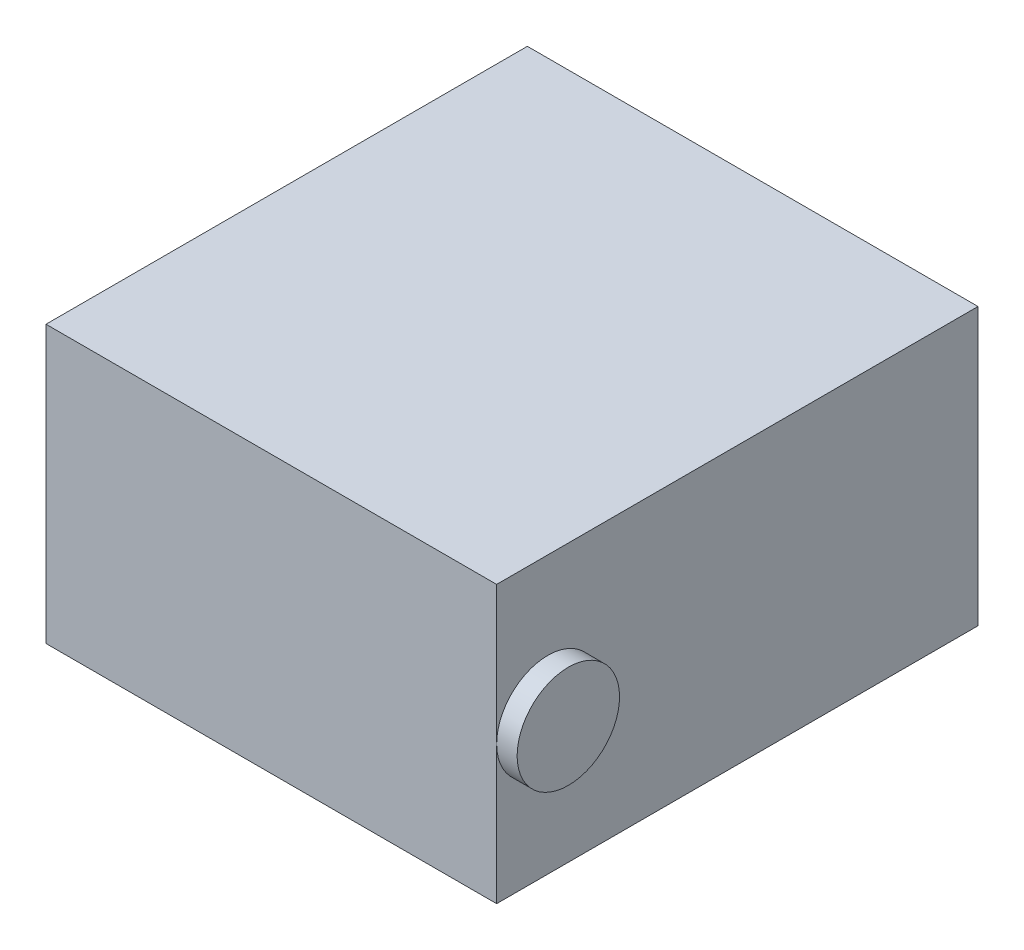
ISO-10303-21;
HEADER;
FILE_DESCRIPTION(('STEP AP214'),'2;1');
FILE_NAME('part.step','',(''),(''),'','','');
FILE_SCHEMA(('AUTOMOTIVE_DESIGN { 1 0 10303 214 1 1 1 1 }'));
ENDSEC;
DATA;
#1=APPLICATION_CONTEXT('core data for automotive mechanical design processes');
#2=APPLICATION_PROTOCOL_DEFINITION('international standard','automotive_design',2000,#1);
#3=PRODUCT_CONTEXT('',#1,'mechanical');
#4=PRODUCT('Part','Part','',(#3));
#5=PRODUCT_RELATED_PRODUCT_CATEGORY('part','',(#4));
#6=PRODUCT_DEFINITION_FORMATION('','',#4);
#7=PRODUCT_DEFINITION_CONTEXT('part definition',#1,'design');
#8=PRODUCT_DEFINITION('design','',#6,#7);
#9=PRODUCT_DEFINITION_SHAPE('','',#8);
#10=(LENGTH_UNIT() NAMED_UNIT(*) SI_UNIT(.MILLI.,.METRE.));
#11=(NAMED_UNIT(*) PLANE_ANGLE_UNIT() SI_UNIT($,.RADIAN.));
#12=(NAMED_UNIT(*) SI_UNIT($,.STERADIAN.) SOLID_ANGLE_UNIT());
#13=UNCERTAINTY_MEASURE_WITH_UNIT(LENGTH_MEASURE(1.E-05),#10,'distance_accuracy_value','');
#14=(GEOMETRIC_REPRESENTATION_CONTEXT(3) GLOBAL_UNCERTAINTY_ASSIGNED_CONTEXT((#13)) GLOBAL_UNIT_ASSIGNED_CONTEXT((#10,
#11,#12)) REPRESENTATION_CONTEXT('',''));
#15=CARTESIAN_POINT('',(0.,0.,0.));
#16=DIRECTION('',(0.,0.,1.));
#17=DIRECTION('',(1.,0.,0.));
#18=AXIS2_PLACEMENT_3D('',#15,#16,#17);
#19=CARTESIAN_POINT('',(0.,85.725,0.));
#20=DIRECTION('',(1.,0.,0.));
#21=DIRECTION('',(0.,0.,-1.));
#22=AXIS2_PLACEMENT_3D('',#19,#20,#21);
#23=PLANE('',#22);
#24=CARTESIAN_POINT('',(0.,79.375,-6.35));
#25=DIRECTION('',(-1.,0.,0.));
#26=DIRECTION('',(0.,0.,1.));
#27=AXIS2_PLACEMENT_3D('',#24,#25,#26);
#28=CIRCLE('',#27,1.5875);
#29=CARTESIAN_POINT('',(0.,79.375,-4.7625));
#30=VERTEX_POINT('',#29);
#31=EDGE_CURVE('E194',#30,#30,#28,.T.);
#32=ORIENTED_EDGE('',*,*,#31,.F.);
#33=EDGE_LOOP('',(#32));
#34=FACE_BOUND('',#33,.T.);
#35=CARTESIAN_POINT('',(0.,79.375,-142.875));
#36=DIRECTION('',(-1.,0.,0.));
#37=DIRECTION('',(0.,0.,1.));
#38=AXIS2_PLACEMENT_3D('',#35,#36,#37);
#39=CIRCLE('',#38,1.58749999999999);
#40=CARTESIAN_POINT('',(0.,79.375,-141.2875));
#41=VERTEX_POINT('',#40);
#42=EDGE_CURVE('E189',#41,#41,#39,.T.);
#43=ORIENTED_EDGE('',*,*,#42,.F.);
#44=EDGE_LOOP('',(#43));
#45=FACE_BOUND('',#44,.T.);
#46=CARTESIAN_POINT('',(0.,15.875,-142.875));
#47=DIRECTION('',(-1.,0.,0.));
#48=DIRECTION('',(0.,0.,1.));
#49=AXIS2_PLACEMENT_3D('',#46,#47,#48);
#50=CIRCLE('',#49,1.58749999999999);
#51=CARTESIAN_POINT('',(0.,15.875,-141.2875));
#52=VERTEX_POINT('',#51);
#53=EDGE_CURVE('E185',#52,#52,#50,.T.);
#54=ORIENTED_EDGE('',*,*,#53,.F.);
#55=EDGE_LOOP('',(#54));
#56=FACE_BOUND('',#55,.T.);
#57=CARTESIAN_POINT('',(0.,6.35,-30.1625));
#58=DIRECTION('',(-1.,0.,0.));
#59=DIRECTION('',(0.,0.,1.));
#60=AXIS2_PLACEMENT_3D('',#57,#58,#59);
#61=CIRCLE('',#60,1.5875);
#62=CARTESIAN_POINT('',(0.,6.35,-28.575));
#63=VERTEX_POINT('',#62);
#64=EDGE_CURVE('E179',#63,#63,#61,.T.);
#65=ORIENTED_EDGE('',*,*,#64,.F.);
#66=EDGE_LOOP('',(#65));
#67=FACE_BOUND('',#66,.T.);
#68=DIRECTION('',(0.,0.,1.));
#69=VECTOR('',#68,1.);
#70=CARTESIAN_POINT('',(0.,0.,0.));
#71=LINE('',#70,#69);
#72=CARTESIAN_POINT('',(0.,0.,-149.225));
#73=VERTEX_POINT('',#72);
#74=CARTESIAN_POINT('',(0.,0.,0.));
#75=VERTEX_POINT('',#74);
#76=EDGE_CURVE('E131',#73,#75,#71,.T.);
#77=ORIENTED_EDGE('',*,*,#76,.T.);
#78=DIRECTION('',(0.,-1.,0.));
#79=VECTOR('',#78,1.);
#80=CARTESIAN_POINT('',(0.,85.725,0.));
#81=LINE('',#80,#79);
#82=CARTESIAN_POINT('',(0.,85.725,0.));
#83=VERTEX_POINT('',#82);
#84=EDGE_CURVE('E11',#83,#75,#81,.T.);
#85=ORIENTED_EDGE('',*,*,#84,.F.);
#86=DIRECTION('',(0.,0.,1.));
#87=VECTOR('',#86,1.);
#88=CARTESIAN_POINT('',(0.,85.725,0.));
#89=LINE('',#88,#87);
#90=CARTESIAN_POINT('',(0.,85.725,-149.225));
#91=VERTEX_POINT('',#90);
#92=EDGE_CURVE('E130',#91,#83,#89,.T.);
#93=ORIENTED_EDGE('',*,*,#92,.F.);
#94=DIRECTION('',(0.,-1.,0.));
#95=VECTOR('',#94,1.);
#96=CARTESIAN_POINT('',(0.,85.725,-149.225));
#97=LINE('',#96,#95);
#98=EDGE_CURVE('E118',#91,#73,#97,.T.);
#99=ORIENTED_EDGE('',*,*,#98,.T.);
#100=EDGE_LOOP('',(#77,#85,#93,#99));
#101=FACE_BOUND('',#100,.T.);
#102=DIRECTION('',(0.,-1.,0.));
#103=VECTOR('',#102,1.);
#104=CARTESIAN_POINT('',(0.,53.975,-53.975));
#105=LINE('',#104,#103);
#106=CARTESIAN_POINT('',(0.,53.975,-53.975));
#107=VERTEX_POINT('',#106);
#108=CARTESIAN_POINT('',(0.,31.75,-53.975));
#109=VERTEX_POINT('',#108);
#110=EDGE_CURVE('E52',#107,#109,#105,.T.);
#111=ORIENTED_EDGE('',*,*,#110,.F.);
#112=DIRECTION('',(0.,0.,-1.));
#113=VECTOR('',#112,1.);
#114=CARTESIAN_POINT('',(0.,53.975,-53.975));
#115=LINE('',#114,#113);
#116=CARTESIAN_POINT('',(0.,53.975,-6.35));
#117=VERTEX_POINT('',#116);
#118=EDGE_CURVE('E60',#117,#107,#115,.T.);
#119=ORIENTED_EDGE('',*,*,#118,.F.);
#120=DIRECTION('',(0.,1.,0.));
#121=VECTOR('',#120,1.);
#122=CARTESIAN_POINT('',(0.,53.975,-6.35));
#123=LINE('',#122,#121);
#124=CARTESIAN_POINT('',(0.,31.75,-6.35));
#125=VERTEX_POINT('',#124);
#126=EDGE_CURVE('E154',#125,#117,#123,.T.);
#127=ORIENTED_EDGE('',*,*,#126,.F.);
#128=DIRECTION('',(0.,0.,1.));
#129=VECTOR('',#128,1.);
#130=CARTESIAN_POINT('',(0.,31.75,-53.975));
#131=LINE('',#130,#129);
#132=EDGE_CURVE('E160',#109,#125,#131,.T.);
#133=ORIENTED_EDGE('',*,*,#132,.F.);
#134=EDGE_LOOP('',(#111,#119,#127,#133));
#135=FACE_BOUND('',#134,.T.);
#136=ADVANCED_FACE('F39',(#34,#45,#56,#67,#101,#135),#23,.F.);
#137=CARTESIAN_POINT('',(0.,85.725,0.));
#138=DIRECTION('',(0.,0.,-1.));
#139=DIRECTION('',(-1.,0.,0.));
#140=AXIS2_PLACEMENT_3D('',#137,#138,#139);
#141=PLANE('',#140);
#142=DIRECTION('',(1.,0.,0.));
#143=VECTOR('',#142,1.);
#144=CARTESIAN_POINT('',(0.,0.,0.));
#145=LINE('',#144,#143);
#146=CARTESIAN_POINT('',(139.7,0.,0.));
#147=VERTEX_POINT('',#146);
#148=EDGE_CURVE('E113',#75,#147,#145,.T.);
#149=ORIENTED_EDGE('',*,*,#148,.T.);
#150=DIRECTION('',(0.,-1.,0.));
#151=VECTOR('',#150,1.);
#152=CARTESIAN_POINT('',(139.7,85.725,0.));
#153=LINE('',#152,#151);
#154=CARTESIAN_POINT('',(139.7,42.8625,0.));
#155=VERTEX_POINT('',#154);
#156=EDGE_CURVE('E115',#155,#147,#153,.T.);
#157=ORIENTED_EDGE('',*,*,#156,.F.);
#158=CARTESIAN_POINT('',(139.7,85.725,0.));
#159=VERTEX_POINT('',#158);
#160=EDGE_CURVE('E46',#159,#155,#153,.T.);
#161=ORIENTED_EDGE('',*,*,#160,.F.);
#162=DIRECTION('',(1.,0.,0.));
#163=VECTOR('',#162,1.);
#164=CARTESIAN_POINT('',(0.,85.725,0.));
#165=LINE('',#164,#163);
#166=EDGE_CURVE('E136',#83,#159,#165,.T.);
#167=ORIENTED_EDGE('',*,*,#166,.F.);
#168=ORIENTED_EDGE('',*,*,#84,.T.);
#169=EDGE_LOOP('',(#149,#157,#161,#167,#168));
#170=FACE_BOUND('',#169,.T.);
#171=ADVANCED_FACE('F111',(#170),#141,.F.);
#172=CARTESIAN_POINT('',(139.7,85.725,0.));
#173=DIRECTION('',(-1.,0.,0.));
#174=DIRECTION('',(0.,0.,1.));
#175=AXIS2_PLACEMENT_3D('',#172,#173,#174);
#176=PLANE('',#175);
#177=ORIENTED_EDGE('',*,*,#160,.T.);
#178=CARTESIAN_POINT('',(139.7,42.8625,-15.875));
#179=DIRECTION('',(1.,0.,0.));
#180=DIRECTION('',(0.,0.,-1.));
#181=AXIS2_PLACEMENT_3D('',#178,#179,#180);
#182=CIRCLE('',#181,15.875);
#183=EDGE_CURVE('E107',#155,#155,#182,.T.);
#184=ORIENTED_EDGE('',*,*,#183,.F.);
#185=ORIENTED_EDGE('',*,*,#156,.T.);
#186=DIRECTION('',(0.,0.,-1.));
#187=VECTOR('',#186,1.);
#188=CARTESIAN_POINT('',(139.7,0.,0.));
#189=LINE('',#188,#187);
#190=CARTESIAN_POINT('',(139.7,0.,-149.225));
#191=VERTEX_POINT('',#190);
#192=EDGE_CURVE('E126',#147,#191,#189,.T.);
#193=ORIENTED_EDGE('',*,*,#192,.T.);
#194=DIRECTION('',(0.,-1.,0.));
#195=VECTOR('',#194,1.);
#196=CARTESIAN_POINT('',(139.7,85.725,-149.225));
#197=LINE('',#196,#195);
#198=CARTESIAN_POINT('',(139.7,85.725,-149.225));
#199=VERTEX_POINT('',#198);
#200=EDGE_CURVE('E117',#199,#191,#197,.T.);
#201=ORIENTED_EDGE('',*,*,#200,.F.);
#202=DIRECTION('',(0.,0.,-1.));
#203=VECTOR('',#202,1.);
#204=CARTESIAN_POINT('',(139.7,85.725,0.));
#205=LINE('',#204,#203);
#206=EDGE_CURVE('E109',#159,#199,#205,.T.);
#207=ORIENTED_EDGE('',*,*,#206,.F.);
#208=EDGE_LOOP('',(#177,#184,#185,#193,#201,#207));
#209=FACE_BOUND('',#208,.T.);
#210=ADVANCED_FACE('F106',(#209),#176,.F.);
#211=CARTESIAN_POINT('',(0.,85.725,-149.225));
#212=DIRECTION('',(0.,0.,1.));
#213=DIRECTION('',(1.,0.,0.));
#214=AXIS2_PLACEMENT_3D('',#211,#212,#213);
#215=PLANE('',#214);
#216=DIRECTION('',(-1.,0.,0.));
#217=VECTOR('',#216,1.);
#218=CARTESIAN_POINT('',(0.,0.,-149.225));
#219=LINE('',#218,#217);
#220=EDGE_CURVE('E122',#191,#73,#219,.T.);
#221=ORIENTED_EDGE('',*,*,#220,.T.);
#222=ORIENTED_EDGE('',*,*,#98,.F.);
#223=DIRECTION('',(-1.,0.,0.));
#224=VECTOR('',#223,1.);
#225=CARTESIAN_POINT('',(0.,85.725,-149.225));
#226=LINE('',#225,#224);
#227=EDGE_CURVE('E123',#199,#91,#226,.T.);
#228=ORIENTED_EDGE('',*,*,#227,.F.);
#229=ORIENTED_EDGE('',*,*,#200,.T.);
#230=EDGE_LOOP('',(#221,#222,#228,#229));
#231=FACE_BOUND('',#230,.T.);
#232=ADVANCED_FACE('F223',(#231),#215,.F.);
#233=CARTESIAN_POINT('',(0.,85.725,0.));
#234=DIRECTION('',(0.,-1.,0.));
#235=DIRECTION('',(0.,0.,-1.));
#236=AXIS2_PLACEMENT_3D('',#233,#234,#235);
#237=PLANE('',#236);
#238=ORIENTED_EDGE('',*,*,#92,.T.);
#239=ORIENTED_EDGE('',*,*,#166,.T.);
#240=ORIENTED_EDGE('',*,*,#206,.T.);
#241=ORIENTED_EDGE('',*,*,#227,.T.);
#242=EDGE_LOOP('',(#238,#239,#240,#241));
#243=FACE_BOUND('',#242,.T.);
#244=ADVANCED_FACE('F225',(#243),#237,.F.);
#245=CARTESIAN_POINT('',(0.,0.,0.));
#246=DIRECTION('',(0.,-1.,0.));
#247=DIRECTION('',(0.,0.,-1.));
#248=AXIS2_PLACEMENT_3D('',#245,#246,#247);
#249=PLANE('',#248);
#250=ORIENTED_EDGE('',*,*,#76,.F.);
#251=ORIENTED_EDGE('',*,*,#220,.F.);
#252=ORIENTED_EDGE('',*,*,#192,.F.);
#253=ORIENTED_EDGE('',*,*,#148,.F.);
#254=EDGE_LOOP('',(#250,#251,#252,#253));
#255=FACE_BOUND('',#254,.T.);
#256=ADVANCED_FACE('F219',(#255),#249,.T.);
#257=CARTESIAN_POINT('',(-6.35,53.975,-53.975));
#258=DIRECTION('',(0.,0.,1.));
#259=DIRECTION('',(1.,0.,0.));
#260=AXIS2_PLACEMENT_3D('',#257,#258,#259);
#261=PLANE('',#260);
#262=ORIENTED_EDGE('',*,*,#110,.T.);
#263=DIRECTION('',(1.,0.,0.));
#264=VECTOR('',#263,1.);
#265=CARTESIAN_POINT('',(-6.35,31.75,-53.975));
#266=LINE('',#265,#264);
#267=CARTESIAN_POINT('',(-6.35,31.75,-53.975));
#268=VERTEX_POINT('',#267);
#269=EDGE_CURVE('E133',#268,#109,#266,.T.);
#270=ORIENTED_EDGE('',*,*,#269,.F.);
#271=DIRECTION('',(0.,-1.,0.));
#272=VECTOR('',#271,1.);
#273=CARTESIAN_POINT('',(-6.35,53.975,-53.975));
#274=LINE('',#273,#272);
#275=CARTESIAN_POINT('',(-6.35,53.975,-53.975));
#276=VERTEX_POINT('',#275);
#277=EDGE_CURVE('E152',#276,#268,#274,.T.);
#278=ORIENTED_EDGE('',*,*,#277,.F.);
#279=DIRECTION('',(1.,0.,0.));
#280=VECTOR('',#279,1.);
#281=CARTESIAN_POINT('',(-6.35,53.975,-53.975));
#282=LINE('',#281,#280);
#283=EDGE_CURVE('E149',#276,#107,#282,.T.);
#284=ORIENTED_EDGE('',*,*,#283,.T.);
#285=EDGE_LOOP('',(#262,#270,#278,#284));
#286=FACE_BOUND('',#285,.T.);
#287=ADVANCED_FACE('F378',(#286),#261,.F.);
#288=CARTESIAN_POINT('',(-6.35,31.75,-53.975));
#289=DIRECTION('',(0.,1.,0.));
#290=DIRECTION('',(0.,0.,1.));
#291=AXIS2_PLACEMENT_3D('',#288,#289,#290);
#292=PLANE('',#291);
#293=ORIENTED_EDGE('',*,*,#132,.T.);
#294=DIRECTION('',(1.,0.,0.));
#295=VECTOR('',#294,1.);
#296=CARTESIAN_POINT('',(-6.35,31.75,-6.35));
#297=LINE('',#296,#295);
#298=CARTESIAN_POINT('',(-6.35,31.75,-6.35));
#299=VERTEX_POINT('',#298);
#300=EDGE_CURVE('E141',#299,#125,#297,.T.);
#301=ORIENTED_EDGE('',*,*,#300,.F.);
#302=DIRECTION('',(0.,0.,1.));
#303=VECTOR('',#302,1.);
#304=CARTESIAN_POINT('',(-6.35,31.75,-53.975));
#305=LINE('',#304,#303);
#306=EDGE_CURVE('E164',#268,#299,#305,.T.);
#307=ORIENTED_EDGE('',*,*,#306,.F.);
#308=ORIENTED_EDGE('',*,*,#269,.T.);
#309=EDGE_LOOP('',(#293,#301,#307,#308));
#310=FACE_BOUND('',#309,.T.);
#311=ADVANCED_FACE('F367',(#310),#292,.F.);
#312=CARTESIAN_POINT('',(-6.35,53.975,-6.35));
#313=DIRECTION('',(0.,0.,-1.));
#314=DIRECTION('',(-1.,0.,0.));
#315=AXIS2_PLACEMENT_3D('',#312,#313,#314);
#316=PLANE('',#315);
#317=ORIENTED_EDGE('',*,*,#126,.T.);
#318=DIRECTION('',(1.,0.,0.));
#319=VECTOR('',#318,1.);
#320=CARTESIAN_POINT('',(-6.35,53.975,-6.35));
#321=LINE('',#320,#319);
#322=CARTESIAN_POINT('',(-6.35,53.975,-6.35));
#323=VERTEX_POINT('',#322);
#324=EDGE_CURVE('E148',#323,#117,#321,.T.);
#325=ORIENTED_EDGE('',*,*,#324,.F.);
#326=DIRECTION('',(0.,1.,0.));
#327=VECTOR('',#326,1.);
#328=CARTESIAN_POINT('',(-6.35,53.975,-6.35));
#329=LINE('',#328,#327);
#330=EDGE_CURVE('E162',#299,#323,#329,.T.);
#331=ORIENTED_EDGE('',*,*,#330,.F.);
#332=ORIENTED_EDGE('',*,*,#300,.T.);
#333=EDGE_LOOP('',(#317,#325,#331,#332));
#334=FACE_BOUND('',#333,.T.);
#335=ADVANCED_FACE('F363',(#334),#316,.F.);
#336=CARTESIAN_POINT('',(-6.35,53.975,-53.975));
#337=DIRECTION('',(0.,-1.,0.));
#338=DIRECTION('',(0.,0.,-1.));
#339=AXIS2_PLACEMENT_3D('',#336,#337,#338);
#340=PLANE('',#339);
#341=ORIENTED_EDGE('',*,*,#118,.T.);
#342=ORIENTED_EDGE('',*,*,#283,.F.);
#343=DIRECTION('',(0.,0.,-1.));
#344=VECTOR('',#343,1.);
#345=CARTESIAN_POINT('',(-6.35,53.975,-53.975));
#346=LINE('',#345,#344);
#347=EDGE_CURVE('E155',#323,#276,#346,.T.);
#348=ORIENTED_EDGE('',*,*,#347,.F.);
#349=ORIENTED_EDGE('',*,*,#324,.T.);
#350=EDGE_LOOP('',(#341,#342,#348,#349));
#351=FACE_BOUND('',#350,.T.);
#352=ADVANCED_FACE('F354',(#351),#340,.F.);
#353=CARTESIAN_POINT('',(-6.35,0.,0.));
#354=DIRECTION('',(-1.,0.,0.));
#355=DIRECTION('',(0.,0.,1.));
#356=AXIS2_PLACEMENT_3D('',#353,#354,#355);
#357=PLANE('',#356);
#358=ORIENTED_EDGE('',*,*,#277,.T.);
#359=ORIENTED_EDGE('',*,*,#306,.T.);
#360=ORIENTED_EDGE('',*,*,#330,.T.);
#361=ORIENTED_EDGE('',*,*,#347,.T.);
#362=EDGE_LOOP('',(#358,#359,#360,#361));
#363=FACE_BOUND('',#362,.T.);
#364=ADVANCED_FACE('F244',(#363),#357,.T.);
#365=CARTESIAN_POINT('',(146.05,42.8625,-15.875));
#366=DIRECTION('',(-1.,0.,0.));
#367=DIRECTION('',(0.,0.,1.));
#368=AXIS2_PLACEMENT_3D('',#365,#366,#367);
#369=CYLINDRICAL_SURFACE('',#368,15.875);
#370=CARTESIAN_POINT('',(146.05,42.8625,-15.875));
#371=DIRECTION('',(1.,0.,0.));
#372=DIRECTION('',(0.,0.,-1.));
#373=AXIS2_PLACEMENT_3D('',#370,#371,#372);
#374=CIRCLE('',#373,15.875);
#375=CARTESIAN_POINT('',(146.05,42.8625,-31.75));
#376=VERTEX_POINT('',#375);
#377=EDGE_CURVE('E161',#376,#376,#374,.T.);
#378=ORIENTED_EDGE('',*,*,#377,.F.);
#379=EDGE_LOOP('',(#378));
#380=FACE_BOUND('',#379,.T.);
#381=ORIENTED_EDGE('',*,*,#183,.T.);
#382=EDGE_LOOP('',(#381));
#383=FACE_BOUND('',#382,.T.);
#384=ADVANCED_FACE('F252',(#380,#383),#369,.T.);
#385=CARTESIAN_POINT('',(146.05,42.8625,-15.875));
#386=DIRECTION('',(1.,0.,0.));
#387=DIRECTION('',(0.,0.,-1.));
#388=AXIS2_PLACEMENT_3D('',#385,#386,#387);
#389=PLANE('',#388);
#390=ORIENTED_EDGE('',*,*,#377,.T.);
#391=EDGE_LOOP('',(#390));
#392=FACE_BOUND('',#391,.T.);
#393=ADVANCED_FACE('F258',(#392),#389,.T.);
#394=CARTESIAN_POINT('',(6.35,6.35,-30.1625));
#395=DIRECTION('',(-1.,0.,0.));
#396=DIRECTION('',(0.,0.,1.));
#397=AXIS2_PLACEMENT_3D('',#394,#395,#396);
#398=CYLINDRICAL_SURFACE('',#397,1.5875);
#399=CARTESIAN_POINT('',(6.35,6.35,-30.1625));
#400=DIRECTION('',(-1.,0.,0.));
#401=DIRECTION('',(0.,0.,1.));
#402=AXIS2_PLACEMENT_3D('',#399,#400,#401);
#403=CIRCLE('',#402,1.5875);
#404=CARTESIAN_POINT('',(6.35,6.35,-28.575));
#405=VERTEX_POINT('',#404);
#406=EDGE_CURVE('E174',#405,#405,#403,.T.);
#407=ORIENTED_EDGE('',*,*,#406,.F.);
#408=EDGE_LOOP('',(#407));
#409=FACE_BOUND('',#408,.T.);
#410=ORIENTED_EDGE('',*,*,#64,.T.);
#411=EDGE_LOOP('',(#410));
#412=FACE_BOUND('',#411,.T.);
#413=ADVANCED_FACE('F262',(#409,#412),#398,.F.);
#414=CARTESIAN_POINT('',(6.35,6.35,-30.1625));
#415=DIRECTION('',(-1.,0.,0.));
#416=DIRECTION('',(0.,0.,1.));
#417=AXIS2_PLACEMENT_3D('',#414,#415,#416);
#418=PLANE('',#417);
#419=ORIENTED_EDGE('',*,*,#406,.T.);
#420=EDGE_LOOP('',(#419));
#421=FACE_BOUND('',#420,.T.);
#422=ADVANCED_FACE('F278',(#421),#418,.T.);
#423=CARTESIAN_POINT('',(6.35,15.875,-142.875));
#424=DIRECTION('',(-1.,0.,0.));
#425=DIRECTION('',(0.,0.,1.));
#426=AXIS2_PLACEMENT_3D('',#423,#424,#425);
#427=CYLINDRICAL_SURFACE('',#426,1.58749999999999);
#428=CARTESIAN_POINT('',(6.35,15.875,-142.875));
#429=DIRECTION('',(-1.,0.,0.));
#430=DIRECTION('',(0.,0.,1.));
#431=AXIS2_PLACEMENT_3D('',#428,#429,#430);
#432=CIRCLE('',#431,1.58749999999999);
#433=CARTESIAN_POINT('',(6.35,15.875,-141.2875));
#434=VERTEX_POINT('',#433);
#435=EDGE_CURVE('E178',#434,#434,#432,.T.);
#436=ORIENTED_EDGE('',*,*,#435,.F.);
#437=EDGE_LOOP('',(#436));
#438=FACE_BOUND('',#437,.T.);
#439=ORIENTED_EDGE('',*,*,#53,.T.);
#440=EDGE_LOOP('',(#439));
#441=FACE_BOUND('',#440,.T.);
#442=ADVANCED_FACE('F288',(#438,#441),#427,.F.);
#443=CARTESIAN_POINT('',(6.35,15.875,-142.875));
#444=DIRECTION('',(-1.,0.,0.));
#445=DIRECTION('',(0.,0.,1.));
#446=AXIS2_PLACEMENT_3D('',#443,#444,#445);
#447=PLANE('',#446);
#448=ORIENTED_EDGE('',*,*,#435,.T.);
#449=EDGE_LOOP('',(#448));
#450=FACE_BOUND('',#449,.T.);
#451=ADVANCED_FACE('F299',(#450),#447,.T.);
#452=CARTESIAN_POINT('',(6.35,79.375,-142.875));
#453=DIRECTION('',(-1.,0.,0.));
#454=DIRECTION('',(0.,0.,1.));
#455=AXIS2_PLACEMENT_3D('',#452,#453,#454);
#456=CYLINDRICAL_SURFACE('',#455,1.58749999999999);
#457=CARTESIAN_POINT('',(6.35,79.375,-142.875));
#458=DIRECTION('',(-1.,0.,0.));
#459=DIRECTION('',(0.,0.,1.));
#460=AXIS2_PLACEMENT_3D('',#457,#458,#459);
#461=CIRCLE('',#460,1.58749999999999);
#462=CARTESIAN_POINT('',(6.35,79.375,-141.2875));
#463=VERTEX_POINT('',#462);
#464=EDGE_CURVE('E183',#463,#463,#461,.T.);
#465=ORIENTED_EDGE('',*,*,#464,.F.);
#466=EDGE_LOOP('',(#465));
#467=FACE_BOUND('',#466,.T.);
#468=ORIENTED_EDGE('',*,*,#42,.T.);
#469=EDGE_LOOP('',(#468));
#470=FACE_BOUND('',#469,.T.);
#471=ADVANCED_FACE('F307',(#467,#470),#456,.F.);
#472=CARTESIAN_POINT('',(6.35,79.375,-142.875));
#473=DIRECTION('',(-1.,0.,0.));
#474=DIRECTION('',(0.,0.,1.));
#475=AXIS2_PLACEMENT_3D('',#472,#473,#474);
#476=PLANE('',#475);
#477=ORIENTED_EDGE('',*,*,#464,.T.);
#478=EDGE_LOOP('',(#477));
#479=FACE_BOUND('',#478,.T.);
#480=ADVANCED_FACE('F205',(#479),#476,.T.);
#481=CARTESIAN_POINT('',(6.35,79.375,-6.35));
#482=DIRECTION('',(-1.,0.,0.));
#483=DIRECTION('',(0.,0.,1.));
#484=AXIS2_PLACEMENT_3D('',#481,#482,#483);
#485=CYLINDRICAL_SURFACE('',#484,1.5875);
#486=CARTESIAN_POINT('',(6.35,79.375,-6.35));
#487=DIRECTION('',(-1.,0.,0.));
#488=DIRECTION('',(0.,0.,1.));
#489=AXIS2_PLACEMENT_3D('',#486,#487,#488);
#490=CIRCLE('',#489,1.5875);
#491=CARTESIAN_POINT('',(6.35,79.375,-4.7625));
#492=VERTEX_POINT('',#491);
#493=EDGE_CURVE('E168',#492,#492,#490,.T.);
#494=ORIENTED_EDGE('',*,*,#493,.F.);
#495=EDGE_LOOP('',(#494));
#496=FACE_BOUND('',#495,.T.);
#497=ORIENTED_EDGE('',*,*,#31,.T.);
#498=EDGE_LOOP('',(#497));
#499=FACE_BOUND('',#498,.T.);
#500=ADVANCED_FACE('F200',(#496,#499),#485,.F.);
#501=CARTESIAN_POINT('',(6.35,79.375,-6.35));
#502=DIRECTION('',(-1.,0.,0.));
#503=DIRECTION('',(0.,0.,1.));
#504=AXIS2_PLACEMENT_3D('',#501,#502,#503);
#505=PLANE('',#504);
#506=ORIENTED_EDGE('',*,*,#493,.T.);
#507=EDGE_LOOP('',(#506));
#508=FACE_BOUND('',#507,.T.);
#509=ADVANCED_FACE('F197',(#508),#505,.T.);
#510=CLOSED_SHELL('',(#136,#171,#210,#232,#244,#256,#287,#311,#335,#352,#364,#384,#393,#413,
#422,#442,#451,#471,#480,#500,#509));
#511=MANIFOLD_SOLID_BREP('B2',#510);
#512=ADVANCED_BREP_SHAPE_REPRESENTATION('',(#18,#511),#14);
#513=SHAPE_DEFINITION_REPRESENTATION(#9,#512);
ENDSEC;
END-ISO-10303-21;
